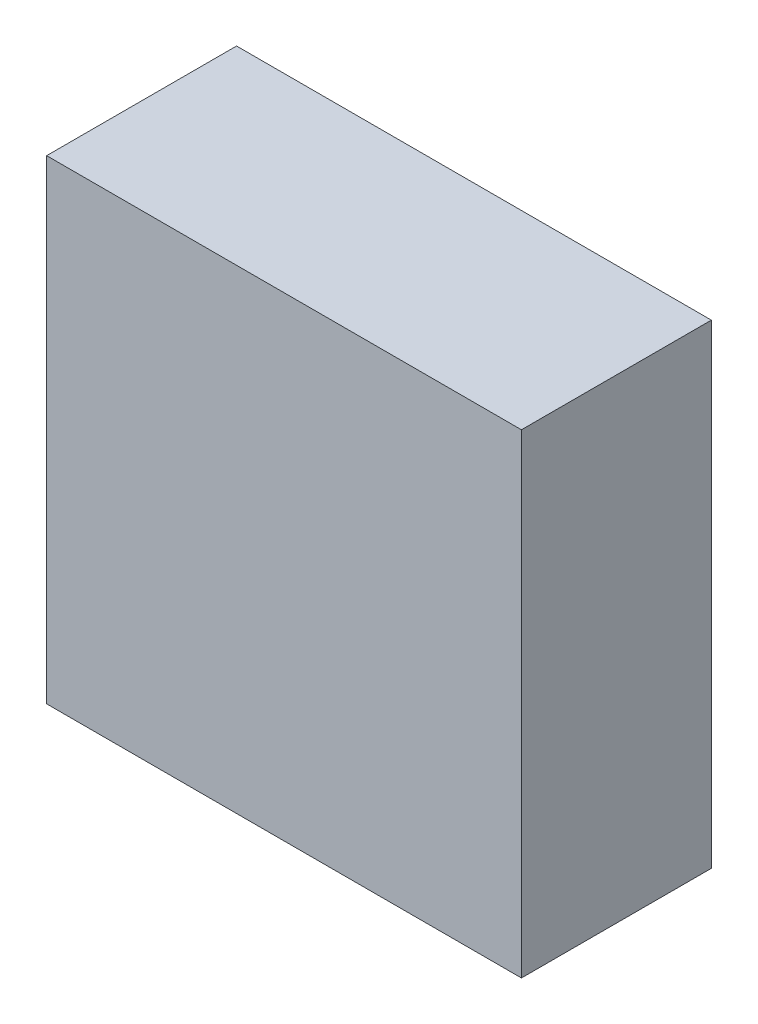
ISO-10303-21;
HEADER;
FILE_DESCRIPTION(('STEP AP214'),'2;1');
FILE_NAME('part.step','',(''),(''),'','','');
FILE_SCHEMA(('AUTOMOTIVE_DESIGN { 1 0 10303 214 1 1 1 1 }'));
ENDSEC;
DATA;
#1=APPLICATION_CONTEXT('core data for automotive mechanical design processes');
#2=APPLICATION_PROTOCOL_DEFINITION('international standard','automotive_design',2000,#1);
#3=PRODUCT_CONTEXT('',#1,'mechanical');
#4=PRODUCT('Part','Part','',(#3));
#5=PRODUCT_RELATED_PRODUCT_CATEGORY('part','',(#4));
#6=PRODUCT_DEFINITION_FORMATION('','',#4);
#7=PRODUCT_DEFINITION_CONTEXT('part definition',#1,'design');
#8=PRODUCT_DEFINITION('design','',#6,#7);
#9=PRODUCT_DEFINITION_SHAPE('','',#8);
#10=(LENGTH_UNIT() NAMED_UNIT(*) SI_UNIT(.MILLI.,.METRE.));
#11=(NAMED_UNIT(*) PLANE_ANGLE_UNIT() SI_UNIT($,.RADIAN.));
#12=(NAMED_UNIT(*) SI_UNIT($,.STERADIAN.) SOLID_ANGLE_UNIT());
#13=UNCERTAINTY_MEASURE_WITH_UNIT(LENGTH_MEASURE(1.E-05),#10,'distance_accuracy_value','');
#14=(GEOMETRIC_REPRESENTATION_CONTEXT(3) GLOBAL_UNCERTAINTY_ASSIGNED_CONTEXT((#13)) GLOBAL_UNIT_ASSIGNED_CONTEXT((#10,
#11,#12)) REPRESENTATION_CONTEXT('',''));
#15=CARTESIAN_POINT('',(0.,0.,0.));
#16=DIRECTION('',(0.,0.,1.));
#17=DIRECTION('',(1.,0.,0.));
#18=AXIS2_PLACEMENT_3D('',#15,#16,#17);
#19=CARTESIAN_POINT('',(25.4138657433548,4.11430107915622,-0.699999021540813));
#20=DIRECTION('',(0.,8.74227339409095E-08,-1.));
#21=DIRECTION('',(1.19248806384999E-08,1.,8.74227339409095E-08));
#22=AXIS2_PLACEMENT_3D('',#19,#20,#21);
#23=PLANE('',#22);
#24=CARTESIAN_POINT('',(25.4138657433548,4.11430107915622,-0.699999021540813));
#25=DIRECTION('',(0.,8.74227339409095E-08,-1.));
#26=DIRECTION('',(1.19248806384999E-08,1.,8.74227339409095E-08));
#27=AXIS2_PLACEMENT_3D('',#24,#25,#26);
#28=CIRCLE('',#27,0.125);
#29=CARTESIAN_POINT('',(25.4138657448454,4.23930107915622,-0.699999010612971));
#30=VERTEX_POINT('',#29);
#31=EDGE_CURVE('E11',#30,#30,#28,.T.);
#32=ORIENTED_EDGE('',*,*,#31,.T.);
#33=EDGE_LOOP('',(#32));
#34=FACE_BOUND('',#33,.T.);
#35=ADVANCED_FACE('F17',(#34),#23,.T.);
#36=CARTESIAN_POINT('',(25.4138657433548,4.11430107915622,-0.699999021540813));
#37=DIRECTION('',(0.,8.74227339409095E-08,-1.));
#38=DIRECTION('',(1.19248806384999E-08,1.,8.74227339409095E-08));
#39=AXIS2_PLACEMENT_3D('',#36,#37,#38);
#40=CYLINDRICAL_SURFACE('',#39,0.125);
#41=CARTESIAN_POINT('',(25.4138657433548,4.11430108789851,-0.799999021540812));
#42=DIRECTION('',(0.,8.74227339409095E-08,-1.));
#43=DIRECTION('',(1.19248806384999E-08,1.,8.74227339409095E-08));
#44=AXIS2_PLACEMENT_3D('',#41,#42,#43);
#45=CIRCLE('',#44,0.125);
#46=CARTESIAN_POINT('',(25.4138657448454,4.23930108789851,-0.79999901061297));
#47=VERTEX_POINT('',#46);
#48=EDGE_CURVE('E111',#47,#47,#45,.T.);
#49=ORIENTED_EDGE('',*,*,#48,.T.);
#50=EDGE_LOOP('',(#49));
#51=FACE_BOUND('',#50,.T.);
#52=ORIENTED_EDGE('',*,*,#31,.F.);
#53=EDGE_LOOP('',(#52));
#54=FACE_BOUND('',#53,.T.);
#55=ADVANCED_FACE('F169',(#51,#54),#40,.F.);
#56=CARTESIAN_POINT('',(23.7471990965626,5.78096770450212,1.12416374386387E-06));
#57=DIRECTION('',(1.19248806384999E-08,1.,8.74227339409095E-08));
#58=DIRECTION('',(0.,8.74227339409095E-08,-1.));
#59=AXIS2_PLACEMENT_3D('',#56,#57,#58);
#60=PLANE('',#59);
#61=DIRECTION('',(0.,8.74227339409095E-08,-1.));
#62=VECTOR('',#61,1.);
#63=CARTESIAN_POINT('',(23.7471990965626,5.78096770450212,1.12416374386387E-06));
#64=LINE('',#63,#62);
#65=CARTESIAN_POINT('',(23.7471990965626,5.78096770450212,1.12416374386387E-06));
#66=VERTEX_POINT('',#65);
#67=CARTESIAN_POINT('',(23.7471990965626,5.78096777444032,-0.799998875836254));
#68=VERTEX_POINT('',#67);
#69=EDGE_CURVE('E76',#66,#68,#64,.T.);
#70=ORIENTED_EDGE('',*,*,#69,.F.);
#71=DIRECTION('',(1.,-1.19248806384999E-08,0.));
#72=VECTOR('',#71,1.);
#73=CARTESIAN_POINT('',(23.7471990965626,5.78096770450212,1.12416374386387E-06));
#74=LINE('',#73,#72);
#75=CARTESIAN_POINT('',(25.7471990965625,5.78096768065237,1.12416374169547E-06));
#76=VERTEX_POINT('',#75);
#77=EDGE_CURVE('E26',#66,#76,#74,.T.);
#78=ORIENTED_EDGE('',*,*,#77,.T.);
#79=DIRECTION('',(0.,8.74227339409095E-08,-1.));
#80=VECTOR('',#79,1.);
#81=CARTESIAN_POINT('',(25.7471990965625,5.78096768065237,1.12416374169547E-06));
#82=LINE('',#81,#80);
#83=CARTESIAN_POINT('',(25.7471990965625,5.78096775059053,-0.799998875836256));
#84=VERTEX_POINT('',#83);
#85=EDGE_CURVE('E71',#76,#84,#82,.T.);
#86=ORIENTED_EDGE('',*,*,#85,.T.);
#87=DIRECTION('',(1.,-1.19248806384999E-08,0.));
#88=VECTOR('',#87,1.);
#89=CARTESIAN_POINT('',(23.7471990965626,5.78096777444032,-0.799998875836254));
#90=LINE('',#89,#88);
#91=EDGE_CURVE('E81',#68,#84,#90,.T.);
#92=ORIENTED_EDGE('',*,*,#91,.F.);
#93=EDGE_LOOP('',(#70,#78,#86,#92));
#94=FACE_BOUND('',#93,.T.);
#95=ADVANCED_FACE('F84',(#94),#60,.T.);
#96=CARTESIAN_POINT('',(23.7471990727128,3.78096770450212,9.49318275898781E-07));
#97=DIRECTION('',(0.,8.74227339409095E-08,-1.));
#98=DIRECTION('',(1.19248806384999E-08,1.,8.74227339409095E-08));
#99=AXIS2_PLACEMENT_3D('',#96,#97,#98);
#100=PLANE('',#99);
#101=DIRECTION('',(1.19248806384999E-08,1.,8.74227339409095E-08));
#102=VECTOR('',#101,1.);
#103=CARTESIAN_POINT('',(25.7471990727128,3.78096768065236,9.49318273730376E-07));
#104=LINE('',#103,#102);
#105=CARTESIAN_POINT('',(25.7471990727128,3.78096768065236,9.49318273730376E-07));
#106=VERTEX_POINT('',#105);
#107=EDGE_CURVE('E69',#106,#76,#104,.T.);
#108=ORIENTED_EDGE('',*,*,#107,.T.);
#109=ORIENTED_EDGE('',*,*,#77,.F.);
#110=DIRECTION('',(1.19248806384999E-08,1.,8.74227339409095E-08));
#111=VECTOR('',#110,1.);
#112=CARTESIAN_POINT('',(23.7471990727128,3.78096770450212,9.49318275898781E-07));
#113=LINE('',#112,#111);
#114=CARTESIAN_POINT('',(23.7471990727128,3.78096770450212,9.49318275898781E-07));
#115=VERTEX_POINT('',#114);
#116=EDGE_CURVE('E64',#115,#66,#113,.T.);
#117=ORIENTED_EDGE('',*,*,#116,.F.);
#118=DIRECTION('',(1.,-1.19248806384999E-08,0.));
#119=VECTOR('',#118,1.);
#120=CARTESIAN_POINT('',(23.7471990727128,3.78096770450212,9.49318275898781E-07));
#121=LINE('',#120,#119);
#122=EDGE_CURVE('E93',#115,#106,#121,.T.);
#123=ORIENTED_EDGE('',*,*,#122,.T.);
#124=EDGE_LOOP('',(#108,#109,#117,#123));
#125=FACE_BOUND('',#124,.T.);
#126=ADVANCED_FACE('F68',(#125),#100,.F.);
#127=CARTESIAN_POINT('',(25.7471990727128,3.78096768065236,9.49318273730376E-07));
#128=DIRECTION('',(1.,-1.19248806384999E-08,0.));
#129=DIRECTION('',(0.,8.74227339409095E-08,-1.));
#130=AXIS2_PLACEMENT_3D('',#127,#128,#129);
#131=PLANE('',#130);
#132=ORIENTED_EDGE('',*,*,#107,.F.);
#133=DIRECTION('',(0.,8.74227339409095E-08,-1.));
#134=VECTOR('',#133,1.);
#135=CARTESIAN_POINT('',(25.7471990727128,3.78096768065236,9.49318273730376E-07));
#136=LINE('',#135,#134);
#137=CARTESIAN_POINT('',(25.7471990727128,3.78096775059056,-0.799999050681724));
#138=VERTEX_POINT('',#137);
#139=EDGE_CURVE('E135',#106,#138,#136,.T.);
#140=ORIENTED_EDGE('',*,*,#139,.T.);
#141=DIRECTION('',(1.19248806384999E-08,1.,8.74227339409095E-08));
#142=VECTOR('',#141,1.);
#143=CARTESIAN_POINT('',(25.7471990727128,3.78096775059056,-0.799999050681724));
#144=LINE('',#143,#142);
#145=EDGE_CURVE('E109',#138,#84,#144,.T.);
#146=ORIENTED_EDGE('',*,*,#145,.T.);
#147=ORIENTED_EDGE('',*,*,#85,.F.);
#148=EDGE_LOOP('',(#132,#140,#146,#147));
#149=FACE_BOUND('',#148,.T.);
#150=ADVANCED_FACE('F158',(#149),#131,.T.);
#151=CARTESIAN_POINT('',(23.7471990727128,3.78096777444031,-0.799999050681722));
#152=DIRECTION('',(0.,8.74227339409095E-08,-1.));
#153=DIRECTION('',(1.19248806384999E-08,1.,8.74227339409095E-08));
#154=AXIS2_PLACEMENT_3D('',#151,#152,#153);
#155=PLANE('',#154);
#156=ORIENTED_EDGE('',*,*,#48,.F.);
#157=EDGE_LOOP('',(#156));
#158=FACE_BOUND('',#157,.T.);
#159=DIRECTION('',(1.,-1.19248806384999E-08,0.));
#160=VECTOR('',#159,1.);
#161=CARTESIAN_POINT('',(23.7471990727128,3.78096777444031,-0.799999050681722));
#162=LINE('',#161,#160);
#163=CARTESIAN_POINT('',(23.7471990727128,3.78096777444031,-0.799999050681722));
#164=VERTEX_POINT('',#163);
#165=EDGE_CURVE('E139',#164,#138,#162,.T.);
#166=ORIENTED_EDGE('',*,*,#165,.F.);
#167=DIRECTION('',(1.19248806384999E-08,1.,8.74227339409095E-08));
#168=VECTOR('',#167,1.);
#169=CARTESIAN_POINT('',(23.7471990727128,3.78096777444031,-0.799999050681722));
#170=LINE('',#169,#168);
#171=EDGE_CURVE('E82',#164,#68,#170,.T.);
#172=ORIENTED_EDGE('',*,*,#171,.T.);
#173=ORIENTED_EDGE('',*,*,#91,.T.);
#174=ORIENTED_EDGE('',*,*,#145,.F.);
#175=EDGE_LOOP('',(#166,#172,#173,#174));
#176=FACE_BOUND('',#175,.T.);
#177=ADVANCED_FACE('F156',(#158,#176),#155,.T.);
#178=CARTESIAN_POINT('',(23.7471990727128,3.78096770450212,9.49318275898781E-07));
#179=DIRECTION('',(1.,-1.19248806384999E-08,0.));
#180=DIRECTION('',(0.,8.74227339409095E-08,-1.));
#181=AXIS2_PLACEMENT_3D('',#178,#179,#180);
#182=PLANE('',#181);
#183=ORIENTED_EDGE('',*,*,#69,.T.);
#184=ORIENTED_EDGE('',*,*,#171,.F.);
#185=DIRECTION('',(0.,8.74227339409095E-08,-1.));
#186=VECTOR('',#185,1.);
#187=CARTESIAN_POINT('',(23.7471990727128,3.78096770450212,9.49318275898781E-07));
#188=LINE('',#187,#186);
#189=EDGE_CURVE('E78',#115,#164,#188,.T.);
#190=ORIENTED_EDGE('',*,*,#189,.F.);
#191=ORIENTED_EDGE('',*,*,#116,.T.);
#192=EDGE_LOOP('',(#183,#184,#190,#191));
#193=FACE_BOUND('',#192,.T.);
#194=ADVANCED_FACE('F75',(#193),#182,.F.);
#195=CARTESIAN_POINT('',(23.7471990727128,3.78096770450212,9.49318275898781E-07));
#196=DIRECTION('',(1.19248806384999E-08,1.,8.74227339409095E-08));
#197=DIRECTION('',(0.,8.74227339409095E-08,-1.));
#198=AXIS2_PLACEMENT_3D('',#195,#196,#197);
#199=PLANE('',#198);
#200=ORIENTED_EDGE('',*,*,#165,.T.);
#201=ORIENTED_EDGE('',*,*,#139,.F.);
#202=ORIENTED_EDGE('',*,*,#122,.F.);
#203=ORIENTED_EDGE('',*,*,#189,.T.);
#204=EDGE_LOOP('',(#200,#201,#202,#203));
#205=FACE_BOUND('',#204,.T.);
#206=ADVANCED_FACE('F154',(#205),#199,.F.);
#207=CLOSED_SHELL('',(#35,#55,#95,#126,#150,#177,#194,#206));
#208=MANIFOLD_SOLID_BREP('B1',#207);
#209=ADVANCED_BREP_SHAPE_REPRESENTATION('',(#18,#208),#14);
#210=SHAPE_DEFINITION_REPRESENTATION(#9,#209);
ENDSEC;
END-ISO-10303-21;
